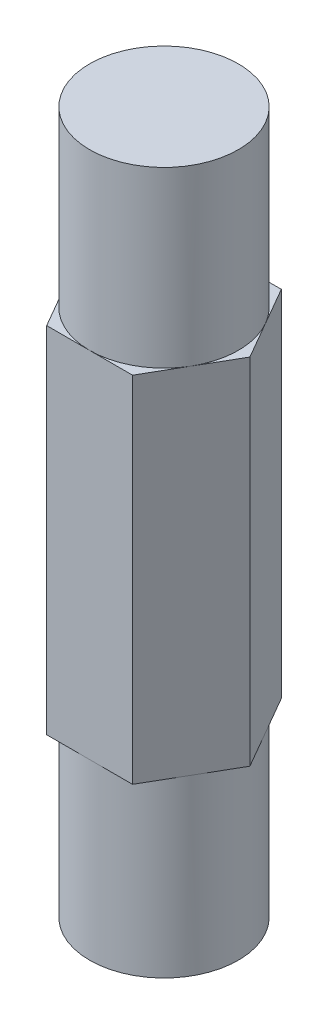
ISO-10303-21;
HEADER;
FILE_DESCRIPTION(('STEP AP214'),'2;1');
FILE_NAME('part.step','',(''),(''),'','','');
FILE_SCHEMA(('AUTOMOTIVE_DESIGN { 1 0 10303 214 1 1 1 1 }'));
ENDSEC;
DATA;
#1=APPLICATION_CONTEXT('core data for automotive mechanical design processes');
#2=APPLICATION_PROTOCOL_DEFINITION('international standard','automotive_design',2000,#1);
#3=PRODUCT_CONTEXT('',#1,'mechanical');
#4=PRODUCT('Part','Part','',(#3));
#5=PRODUCT_RELATED_PRODUCT_CATEGORY('part','',(#4));
#6=PRODUCT_DEFINITION_FORMATION('','',#4);
#7=PRODUCT_DEFINITION_CONTEXT('part definition',#1,'design');
#8=PRODUCT_DEFINITION('design','',#6,#7);
#9=PRODUCT_DEFINITION_SHAPE('','',#8);
#10=(LENGTH_UNIT() NAMED_UNIT(*) SI_UNIT(.MILLI.,.METRE.));
#11=(NAMED_UNIT(*) PLANE_ANGLE_UNIT() SI_UNIT($,.RADIAN.));
#12=(NAMED_UNIT(*) SI_UNIT($,.STERADIAN.) SOLID_ANGLE_UNIT());
#13=UNCERTAINTY_MEASURE_WITH_UNIT(LENGTH_MEASURE(1.E-05),#10,'distance_accuracy_value','');
#14=(GEOMETRIC_REPRESENTATION_CONTEXT(3) GLOBAL_UNCERTAINTY_ASSIGNED_CONTEXT((#13)) GLOBAL_UNIT_ASSIGNED_CONTEXT((#10,
#11,#12)) REPRESENTATION_CONTEXT('',''));
#15=CARTESIAN_POINT('',(0.,0.,0.));
#16=DIRECTION('',(0.,0.,1.));
#17=DIRECTION('',(1.,0.,0.));
#18=AXIS2_PLACEMENT_3D('',#15,#16,#17);
#19=CARTESIAN_POINT('',(-11.3221306570156,22.475,-32.0213126804892));
#20=DIRECTION('',(0.866025403784439,0.,0.5));
#21=DIRECTION('',(0.5,0.,-0.866025403784439));
#22=AXIS2_PLACEMENT_3D('',#19,#20,#21);
#23=PLANE('',#22);
#24=DIRECTION('',(-0.5,0.,0.866025403784439));
#25=VECTOR('',#24,1.);
#26=CARTESIAN_POINT('',(-22.3572331146759,-11.345,-12.9079545570934));
#27=LINE('',#26,#25);
#28=CARTESIAN_POINT('',(-12.6969459855234,-11.345,-29.6400626804892));
#29=VERTEX_POINT('',#28);
#30=CARTESIAN_POINT('',(-14.0717613140312,-11.345,-27.2588126804892));
#31=VERTEX_POINT('',#30);
#32=EDGE_CURVE('E179',#29,#31,#27,.T.);
#33=ORIENTED_EDGE('',*,*,#32,.T.);
#34=DIRECTION('',(0.,-1.,0.));
#35=VECTOR('',#34,1.);
#36=CARTESIAN_POINT('',(-14.0717613140312,22.475,-27.2588126804892));
#37=LINE('',#36,#35);
#38=CARTESIAN_POINT('',(-14.0717613140312,11.345,-27.2588126804892));
#39=VERTEX_POINT('',#38);
#40=EDGE_CURVE('E12',#39,#31,#37,.T.);
#41=ORIENTED_EDGE('',*,*,#40,.F.);
#42=DIRECTION('',(-0.5,0.,0.866025403784439));
#43=VECTOR('',#42,1.);
#44=CARTESIAN_POINT('',(-22.3572331146759,11.345,-12.9079545570934));
#45=LINE('',#44,#43);
#46=CARTESIAN_POINT('',(-12.6969459855234,11.345,-29.6400626804892));
#47=VERTEX_POINT('',#46);
#48=EDGE_CURVE('E224',#47,#39,#45,.T.);
#49=ORIENTED_EDGE('',*,*,#48,.F.);
#50=DIRECTION('',(-0.5,0.,0.866025403784439));
#51=VECTOR('',#50,1.);
#52=CARTESIAN_POINT('',(-22.3572331146759,11.345,-12.9079545570934));
#53=LINE('',#52,#51);
#54=CARTESIAN_POINT('',(-11.3221306570156,11.345,-32.0213126804892));
#55=VERTEX_POINT('',#54);
#56=EDGE_CURVE('E244',#55,#47,#53,.T.);
#57=ORIENTED_EDGE('',*,*,#56,.F.);
#58=DIRECTION('',(0.,-1.,0.));
#59=VECTOR('',#58,1.);
#60=CARTESIAN_POINT('',(-11.3221306570156,22.475,-32.0213126804892));
#61=LINE('',#60,#59);
#62=CARTESIAN_POINT('',(-11.3221306570156,-11.345,-32.0213126804892));
#63=VERTEX_POINT('',#62);
#64=EDGE_CURVE('E256',#55,#63,#61,.T.);
#65=ORIENTED_EDGE('',*,*,#64,.T.);
#66=DIRECTION('',(-0.5,0.,0.866025403784439));
#67=VECTOR('',#66,1.);
#68=CARTESIAN_POINT('',(-22.3572331146759,-11.345,-12.9079545570934));
#69=LINE('',#68,#67);
#70=EDGE_CURVE('E281',#63,#29,#69,.T.);
#71=ORIENTED_EDGE('',*,*,#70,.T.);
#72=EDGE_LOOP('',(#33,#41,#49,#57,#65,#71));
#73=FACE_BOUND('',#72,.T.);
#74=ADVANCED_FACE('F75',(#73),#23,.F.);
#75=CARTESIAN_POINT('',(-14.0717613140312,22.475,-27.2588126804892));
#76=DIRECTION('',(0.866025403784439,0.,-0.5));
#77=DIRECTION('',(-0.5,0.,-0.866025403784439));
#78=AXIS2_PLACEMENT_3D('',#75,#76,#77);
#79=PLANE('',#78);
#80=DIRECTION('',(0.5,0.,0.866025403784439));
#81=VECTOR('',#80,1.);
#82=CARTESIAN_POINT('',(1.24959114362914,-11.345,-0.721451783151254));
#83=LINE('',#82,#81);
#84=CARTESIAN_POINT('',(-12.6969459855234,-11.345,-24.8775626804892));
#85=VERTEX_POINT('',#84);
#86=EDGE_CURVE('E177',#31,#85,#83,.T.);
#87=ORIENTED_EDGE('',*,*,#86,.T.);
#88=DIRECTION('',(0.5,0.,0.866025403784439));
#89=VECTOR('',#88,1.);
#90=CARTESIAN_POINT('',(1.24959114362914,-11.345,-0.721451783151254));
#91=LINE('',#90,#89);
#92=CARTESIAN_POINT('',(-11.3221306570156,-11.345,-22.4963126804892));
#93=VERTEX_POINT('',#92);
#94=EDGE_CURVE('E190',#85,#93,#91,.T.);
#95=ORIENTED_EDGE('',*,*,#94,.T.);
#96=DIRECTION('',(0.,-1.,0.));
#97=VECTOR('',#96,1.);
#98=CARTESIAN_POINT('',(-11.3221306570156,22.475,-22.4963126804892));
#99=LINE('',#98,#97);
#100=CARTESIAN_POINT('',(-11.3221306570156,11.345,-22.4963126804892));
#101=VERTEX_POINT('',#100);
#102=EDGE_CURVE('E83',#101,#93,#99,.T.);
#103=ORIENTED_EDGE('',*,*,#102,.F.);
#104=DIRECTION('',(0.5,0.,0.866025403784439));
#105=VECTOR('',#104,1.);
#106=CARTESIAN_POINT('',(1.24959114362914,11.345,-0.721451783151254));
#107=LINE('',#106,#105);
#108=CARTESIAN_POINT('',(-12.6969459855234,11.345,-24.8775626804892));
#109=VERTEX_POINT('',#108);
#110=EDGE_CURVE('E90',#109,#101,#107,.T.);
#111=ORIENTED_EDGE('',*,*,#110,.F.);
#112=DIRECTION('',(0.5,0.,0.866025403784439));
#113=VECTOR('',#112,1.);
#114=CARTESIAN_POINT('',(1.24959114362914,11.345,-0.721451783151254));
#115=LINE('',#114,#113);
#116=EDGE_CURVE('E226',#39,#109,#115,.T.);
#117=ORIENTED_EDGE('',*,*,#116,.F.);
#118=ORIENTED_EDGE('',*,*,#40,.T.);
#119=EDGE_LOOP('',(#87,#95,#103,#111,#117,#118));
#120=FACE_BOUND('',#119,.T.);
#121=ADVANCED_FACE('F188',(#120),#79,.F.);
#122=CARTESIAN_POINT('',(-3.07323868596881,22.475,-27.2588126804892));
#123=DIRECTION('',(-0.866025403784439,0.,0.5));
#124=DIRECTION('',(0.5,0.,0.866025403784439));
#125=AXIS2_PLACEMENT_3D('',#122,#123,#124);
#126=PLANE('',#125);
#127=DIRECTION('',(-0.5,0.,-0.866025403784439));
#128=VECTOR('',#127,1.);
#129=CARTESIAN_POINT('',(9.49848311467592,-11.345,-5.48395178315126));
#130=LINE('',#129,#128);
#131=CARTESIAN_POINT('',(-4.4480540144766,-11.345,-29.6400626804892));
#132=VERTEX_POINT('',#131);
#133=CARTESIAN_POINT('',(-5.8228693429844,-11.345,-32.0213126804892));
#134=VERTEX_POINT('',#133);
#135=EDGE_CURVE('E289',#132,#134,#130,.T.);
#136=ORIENTED_EDGE('',*,*,#135,.T.);
#137=DIRECTION('',(0.,-1.,0.));
#138=VECTOR('',#137,1.);
#139=CARTESIAN_POINT('',(-5.8228693429844,22.475,-32.0213126804892));
#140=LINE('',#139,#138);
#141=CARTESIAN_POINT('',(-5.8228693429844,11.345,-32.0213126804892));
#142=VERTEX_POINT('',#141);
#143=EDGE_CURVE('E265',#142,#134,#140,.T.);
#144=ORIENTED_EDGE('',*,*,#143,.F.);
#145=DIRECTION('',(-0.5,0.,-0.866025403784439));
#146=VECTOR('',#145,1.);
#147=CARTESIAN_POINT('',(9.49848311467592,11.345,-5.48395178315126));
#148=LINE('',#147,#146);
#149=CARTESIAN_POINT('',(-4.4480540144766,11.345,-29.6400626804892));
#150=VERTEX_POINT('',#149);
#151=EDGE_CURVE('E231',#150,#142,#148,.T.);
#152=ORIENTED_EDGE('',*,*,#151,.F.);
#153=DIRECTION('',(-0.5,0.,-0.866025403784439));
#154=VECTOR('',#153,1.);
#155=CARTESIAN_POINT('',(9.49848311467592,11.345,-5.48395178315126));
#156=LINE('',#155,#154);
#157=CARTESIAN_POINT('',(-3.07323868596881,11.345,-27.2588126804892));
#158=VERTEX_POINT('',#157);
#159=EDGE_CURVE('E252',#158,#150,#156,.T.);
#160=ORIENTED_EDGE('',*,*,#159,.F.);
#161=DIRECTION('',(0.,-1.,0.));
#162=VECTOR('',#161,1.);
#163=CARTESIAN_POINT('',(-3.07323868596881,22.475,-27.2588126804892));
#164=LINE('',#163,#162);
#165=CARTESIAN_POINT('',(-3.07323868596881,-11.345,-27.2588126804892));
#166=VERTEX_POINT('',#165);
#167=EDGE_CURVE('E268',#158,#166,#164,.T.);
#168=ORIENTED_EDGE('',*,*,#167,.T.);
#169=DIRECTION('',(-0.5,0.,-0.866025403784439));
#170=VECTOR('',#169,1.);
#171=CARTESIAN_POINT('',(9.49848311467592,-11.345,-5.48395178315126));
#172=LINE('',#171,#170);
#173=EDGE_CURVE('E211',#166,#132,#172,.T.);
#174=ORIENTED_EDGE('',*,*,#173,.T.);
#175=EDGE_LOOP('',(#136,#144,#152,#160,#168,#174));
#176=FACE_BOUND('',#175,.T.);
#177=ADVANCED_FACE('F311',(#176),#126,.F.);
#178=CARTESIAN_POINT('',(-5.8228693429844,22.475,-32.0213126804892));
#179=DIRECTION('',(0.,0.,1.));
#180=DIRECTION('',(1.,0.,0.));
#181=AXIS2_PLACEMENT_3D('',#178,#179,#180);
#182=PLANE('',#181);
#183=DIRECTION('',(-1.,0.,0.));
#184=VECTOR('',#183,1.);
#185=CARTESIAN_POINT('',(0.,-11.345,-32.0213126804892));
#186=LINE('',#185,#184);
#187=CARTESIAN_POINT('',(-8.57249999999999,-11.345,-32.0213126804892));
#188=VERTEX_POINT('',#187);
#189=EDGE_CURVE('E284',#134,#188,#186,.T.);
#190=ORIENTED_EDGE('',*,*,#189,.T.);
#191=DIRECTION('',(-1.,0.,0.));
#192=VECTOR('',#191,1.);
#193=CARTESIAN_POINT('',(0.,-11.345,-32.0213126804892));
#194=LINE('',#193,#192);
#195=EDGE_CURVE('E220',#188,#63,#194,.T.);
#196=ORIENTED_EDGE('',*,*,#195,.T.);
#197=ORIENTED_EDGE('',*,*,#64,.F.);
#198=DIRECTION('',(-1.,0.,0.));
#199=VECTOR('',#198,1.);
#200=CARTESIAN_POINT('',(0.,11.345,-32.0213126804892));
#201=LINE('',#200,#199);
#202=CARTESIAN_POINT('',(-8.57249999999999,11.345,-32.0213126804892));
#203=VERTEX_POINT('',#202);
#204=EDGE_CURVE('E110',#203,#55,#201,.T.);
#205=ORIENTED_EDGE('',*,*,#204,.F.);
#206=DIRECTION('',(-1.,0.,0.));
#207=VECTOR('',#206,1.);
#208=CARTESIAN_POINT('',(0.,11.345,-32.0213126804892));
#209=LINE('',#208,#207);
#210=EDGE_CURVE('E118',#142,#203,#209,.T.);
#211=ORIENTED_EDGE('',*,*,#210,.F.);
#212=ORIENTED_EDGE('',*,*,#143,.T.);
#213=EDGE_LOOP('',(#190,#196,#197,#205,#211,#212));
#214=FACE_BOUND('',#213,.T.);
#215=ADVANCED_FACE('F304',(#214),#182,.F.);
#216=CARTESIAN_POINT('',(-11.3221306570156,22.475,-22.4963126804892));
#217=DIRECTION('',(0.,0.,-1.));
#218=DIRECTION('',(-1.,0.,0.));
#219=AXIS2_PLACEMENT_3D('',#216,#217,#218);
#220=PLANE('',#219);
#221=DIRECTION('',(1.,0.,0.));
#222=VECTOR('',#221,1.);
#223=CARTESIAN_POINT('',(0.,-11.345,-22.4963126804892));
#224=LINE('',#223,#222);
#225=CARTESIAN_POINT('',(-8.57249999999999,-11.345,-22.4963126804892));
#226=VERTEX_POINT('',#225);
#227=CARTESIAN_POINT('',(-5.8228693429844,-11.345,-22.4963126804892));
#228=VERTEX_POINT('',#227);
#229=EDGE_CURVE('E296',#226,#228,#224,.T.);
#230=ORIENTED_EDGE('',*,*,#229,.T.);
#231=DIRECTION('',(0.,-1.,0.));
#232=VECTOR('',#231,1.);
#233=CARTESIAN_POINT('',(-5.8228693429844,22.475,-22.4963126804892));
#234=LINE('',#233,#232);
#235=CARTESIAN_POINT('',(-5.8228693429844,11.345,-22.4963126804892));
#236=VERTEX_POINT('',#235);
#237=EDGE_CURVE('E271',#236,#228,#234,.T.);
#238=ORIENTED_EDGE('',*,*,#237,.F.);
#239=DIRECTION('',(1.,0.,0.));
#240=VECTOR('',#239,1.);
#241=CARTESIAN_POINT('',(0.,11.345,-22.4963126804892));
#242=LINE('',#241,#240);
#243=CARTESIAN_POINT('',(-8.57249999999999,11.345,-22.4963126804892));
#244=VERTEX_POINT('',#243);
#245=EDGE_CURVE('E236',#244,#236,#242,.T.);
#246=ORIENTED_EDGE('',*,*,#245,.F.);
#247=DIRECTION('',(1.,0.,0.));
#248=VECTOR('',#247,1.);
#249=CARTESIAN_POINT('',(0.,11.345,-22.4963126804892));
#250=LINE('',#249,#248);
#251=EDGE_CURVE('E254',#101,#244,#250,.T.);
#252=ORIENTED_EDGE('',*,*,#251,.F.);
#253=ORIENTED_EDGE('',*,*,#102,.T.);
#254=DIRECTION('',(1.,0.,0.));
#255=VECTOR('',#254,1.);
#256=CARTESIAN_POINT('',(0.,-11.345,-22.4963126804892));
#257=LINE('',#256,#255);
#258=EDGE_CURVE('E200',#93,#226,#257,.T.);
#259=ORIENTED_EDGE('',*,*,#258,.T.);
#260=EDGE_LOOP('',(#230,#238,#246,#252,#253,#259));
#261=FACE_BOUND('',#260,.T.);
#262=ADVANCED_FACE('F275',(#261),#220,.F.);
#263=CARTESIAN_POINT('',(-5.8228693429844,22.475,-22.4963126804892));
#264=DIRECTION('',(-0.866025403784439,0.,-0.5));
#265=DIRECTION('',(-0.5,0.,0.866025403784439));
#266=AXIS2_PLACEMENT_3D('',#263,#264,#265);
#267=PLANE('',#266);
#268=DIRECTION('',(0.5,0.,-0.866025403784439));
#269=VECTOR('',#268,1.);
#270=CARTESIAN_POINT('',(-14.1083411436291,-11.345,-8.14545455709335));
#271=LINE('',#270,#269);
#272=CARTESIAN_POINT('',(-4.44805401447661,-11.345,-24.8775626804892));
#273=VERTEX_POINT('',#272);
#274=EDGE_CURVE('E293',#228,#273,#271,.T.);
#275=ORIENTED_EDGE('',*,*,#274,.T.);
#276=DIRECTION('',(0.5,0.,-0.866025403784439));
#277=VECTOR('',#276,1.);
#278=CARTESIAN_POINT('',(-14.1083411436291,-11.345,-8.14545455709335));
#279=LINE('',#278,#277);
#280=EDGE_CURVE('E207',#273,#166,#279,.T.);
#281=ORIENTED_EDGE('',*,*,#280,.T.);
#282=ORIENTED_EDGE('',*,*,#167,.F.);
#283=DIRECTION('',(0.5,0.,-0.866025403784439));
#284=VECTOR('',#283,1.);
#285=CARTESIAN_POINT('',(-14.1083411436291,11.345,-8.14545455709335));
#286=LINE('',#285,#284);
#287=CARTESIAN_POINT('',(-4.44805401447661,11.345,-24.8775626804892));
#288=VERTEX_POINT('',#287);
#289=EDGE_CURVE('E259',#288,#158,#286,.T.);
#290=ORIENTED_EDGE('',*,*,#289,.F.);
#291=DIRECTION('',(0.5,0.,-0.866025403784439));
#292=VECTOR('',#291,1.);
#293=CARTESIAN_POINT('',(-14.1083411436291,11.345,-8.14545455709335));
#294=LINE('',#293,#292);
#295=EDGE_CURVE('E102',#236,#288,#294,.T.);
#296=ORIENTED_EDGE('',*,*,#295,.F.);
#297=ORIENTED_EDGE('',*,*,#237,.T.);
#298=EDGE_LOOP('',(#275,#281,#282,#290,#296,#297));
#299=FACE_BOUND('',#298,.T.);
#300=ADVANCED_FACE('F321',(#299),#267,.F.);
#301=CARTESIAN_POINT('',(0.,22.475,0.));
#302=DIRECTION('',(0.,1.,0.));
#303=DIRECTION('',(0.,0.,1.));
#304=AXIS2_PLACEMENT_3D('',#301,#302,#303);
#305=PLANE('',#304);
#306=CARTESIAN_POINT('',(-8.57249999999999,22.475,-27.2588126804892));
#307=DIRECTION('',(0.,1.,0.));
#308=DIRECTION('',(0.,0.,1.));
#309=AXIS2_PLACEMENT_3D('',#306,#307,#308);
#310=CIRCLE('',#309,4.7625);
#311=CARTESIAN_POINT('',(-8.57249999999999,22.475,-22.4963126804892));
#312=VERTEX_POINT('',#311);
#313=EDGE_CURVE('E239',#312,#312,#310,.T.);
#314=ORIENTED_EDGE('',*,*,#313,.T.);
#315=EDGE_LOOP('',(#314));
#316=FACE_BOUND('',#315,.T.);
#317=ADVANCED_FACE('F351',(#316),#305,.T.);
#318=CARTESIAN_POINT('',(0.,-22.475,0.));
#319=DIRECTION('',(0.,1.,0.));
#320=DIRECTION('',(0.,0.,1.));
#321=AXIS2_PLACEMENT_3D('',#318,#319,#320);
#322=PLANE('',#321);
#323=CARTESIAN_POINT('',(-8.57249999999999,-22.475,-27.2588126804892));
#324=DIRECTION('',(0.,1.,0.));
#325=DIRECTION('',(0.,0.,1.));
#326=AXIS2_PLACEMENT_3D('',#323,#324,#325);
#327=CIRCLE('',#326,4.7625);
#328=CARTESIAN_POINT('',(-8.57249999999999,-22.475,-22.4963126804892));
#329=VERTEX_POINT('',#328);
#330=EDGE_CURVE('E214',#329,#329,#327,.T.);
#331=ORIENTED_EDGE('',*,*,#330,.F.);
#332=EDGE_LOOP('',(#331));
#333=FACE_BOUND('',#332,.T.);
#334=ADVANCED_FACE('F355',(#333),#322,.F.);
#335=CARTESIAN_POINT('',(0.,11.345,0.));
#336=DIRECTION('',(0.,1.,0.));
#337=DIRECTION('',(0.,0.,1.));
#338=AXIS2_PLACEMENT_3D('',#335,#336,#337);
#339=PLANE('',#338);
#340=CARTESIAN_POINT('',(-8.57249999999999,11.345,-27.2588126804892));
#341=DIRECTION('',(0.,1.,0.));
#342=DIRECTION('',(0.,0.,1.));
#343=AXIS2_PLACEMENT_3D('',#340,#341,#342);
#344=CIRCLE('',#343,4.7625);
#345=EDGE_CURVE('E249',#109,#244,#344,.T.);
#346=ORIENTED_EDGE('',*,*,#345,.F.);
#347=ORIENTED_EDGE('',*,*,#110,.T.);
#348=ORIENTED_EDGE('',*,*,#251,.T.);
#349=EDGE_LOOP('',(#346,#347,#348));
#350=FACE_BOUND('',#349,.T.);
#351=ADVANCED_FACE('F358',(#350),#339,.T.);
#352=CARTESIAN_POINT('',(0.,11.345,0.));
#353=DIRECTION('',(0.,1.,0.));
#354=DIRECTION('',(0.,0.,1.));
#355=AXIS2_PLACEMENT_3D('',#352,#353,#354);
#356=PLANE('',#355);
#357=CARTESIAN_POINT('',(-8.57249999999999,11.345,-27.2588126804892));
#358=DIRECTION('',(0.,1.,0.));
#359=DIRECTION('',(0.,0.,1.));
#360=AXIS2_PLACEMENT_3D('',#357,#358,#359);
#361=CIRCLE('',#360,4.7625);
#362=EDGE_CURVE('E246',#288,#150,#361,.T.);
#363=ORIENTED_EDGE('',*,*,#362,.F.);
#364=ORIENTED_EDGE('',*,*,#289,.T.);
#365=ORIENTED_EDGE('',*,*,#159,.T.);
#366=EDGE_LOOP('',(#363,#364,#365));
#367=FACE_BOUND('',#366,.T.);
#368=ADVANCED_FACE('F325',(#367),#356,.T.);
#369=CARTESIAN_POINT('',(-8.57249999999999,11.345,-27.2588126804892));
#370=DIRECTION('',(0.,1.,0.));
#371=DIRECTION('',(0.,0.,1.));
#372=AXIS2_PLACEMENT_3D('',#369,#370,#371);
#373=CYLINDRICAL_SURFACE('',#372,4.7625);
#374=ORIENTED_EDGE('',*,*,#313,.F.);
#375=EDGE_LOOP('',(#374));
#376=FACE_BOUND('',#375,.T.);
#377=CARTESIAN_POINT('',(-8.57249999999999,11.345,-27.2588126804892));
#378=DIRECTION('',(0.,1.,0.));
#379=DIRECTION('',(0.,0.,1.));
#380=AXIS2_PLACEMENT_3D('',#377,#378,#379);
#381=CIRCLE('',#380,4.7625);
#382=EDGE_CURVE('E201',#47,#109,#381,.T.);
#383=ORIENTED_EDGE('',*,*,#382,.T.);
#384=ORIENTED_EDGE('',*,*,#345,.T.);
#385=CARTESIAN_POINT('',(-8.57249999999999,11.345,-27.2588126804892));
#386=DIRECTION('',(0.,1.,0.));
#387=DIRECTION('',(0.,0.,1.));
#388=AXIS2_PLACEMENT_3D('',#385,#386,#387);
#389=CIRCLE('',#388,4.7625);
#390=EDGE_CURVE('E234',#244,#288,#389,.T.);
#391=ORIENTED_EDGE('',*,*,#390,.T.);
#392=ORIENTED_EDGE('',*,*,#362,.T.);
#393=CARTESIAN_POINT('',(-8.57249999999999,11.345,-27.2588126804892));
#394=DIRECTION('',(0.,1.,0.));
#395=DIRECTION('',(0.,0.,1.));
#396=AXIS2_PLACEMENT_3D('',#393,#394,#395);
#397=CIRCLE('',#396,4.7625);
#398=EDGE_CURVE('E229',#150,#203,#397,.T.);
#399=ORIENTED_EDGE('',*,*,#398,.T.);
#400=CARTESIAN_POINT('',(-8.57249999999999,11.345,-27.2588126804892));
#401=DIRECTION('',(0.,1.,0.));
#402=DIRECTION('',(0.,0.,1.));
#403=AXIS2_PLACEMENT_3D('',#400,#401,#402);
#404=CIRCLE('',#403,4.7625);
#405=EDGE_CURVE('E240',#203,#47,#404,.T.);
#406=ORIENTED_EDGE('',*,*,#405,.T.);
#407=EDGE_LOOP('',(#383,#384,#391,#392,#399,#406));
#408=FACE_BOUND('',#407,.T.);
#409=ADVANCED_FACE('F365',(#376,#408),#373,.T.);
#410=CARTESIAN_POINT('',(0.,11.345,0.));
#411=DIRECTION('',(0.,1.,0.));
#412=DIRECTION('',(0.,0.,1.));
#413=AXIS2_PLACEMENT_3D('',#410,#411,#412);
#414=PLANE('',#413);
#415=ORIENTED_EDGE('',*,*,#405,.F.);
#416=ORIENTED_EDGE('',*,*,#204,.T.);
#417=ORIENTED_EDGE('',*,*,#56,.T.);
#418=EDGE_LOOP('',(#415,#416,#417));
#419=FACE_BOUND('',#418,.T.);
#420=ADVANCED_FACE('F306',(#419),#414,.T.);
#421=CARTESIAN_POINT('',(0.,11.345,0.));
#422=DIRECTION('',(0.,1.,0.));
#423=DIRECTION('',(0.,0.,1.));
#424=AXIS2_PLACEMENT_3D('',#421,#422,#423);
#425=PLANE('',#424);
#426=ORIENTED_EDGE('',*,*,#390,.F.);
#427=ORIENTED_EDGE('',*,*,#245,.T.);
#428=ORIENTED_EDGE('',*,*,#295,.T.);
#429=EDGE_LOOP('',(#426,#427,#428));
#430=FACE_BOUND('',#429,.T.);
#431=ADVANCED_FACE('F373',(#430),#425,.T.);
#432=CARTESIAN_POINT('',(0.,11.345,0.));
#433=DIRECTION('',(0.,1.,0.));
#434=DIRECTION('',(0.,0.,1.));
#435=AXIS2_PLACEMENT_3D('',#432,#433,#434);
#436=PLANE('',#435);
#437=ORIENTED_EDGE('',*,*,#398,.F.);
#438=ORIENTED_EDGE('',*,*,#151,.T.);
#439=ORIENTED_EDGE('',*,*,#210,.T.);
#440=EDGE_LOOP('',(#437,#438,#439));
#441=FACE_BOUND('',#440,.T.);
#442=ADVANCED_FACE('F376',(#441),#436,.T.);
#443=CARTESIAN_POINT('',(0.,11.345,0.));
#444=DIRECTION('',(0.,1.,0.));
#445=DIRECTION('',(0.,0.,1.));
#446=AXIS2_PLACEMENT_3D('',#443,#444,#445);
#447=PLANE('',#446);
#448=ORIENTED_EDGE('',*,*,#382,.F.);
#449=ORIENTED_EDGE('',*,*,#48,.T.);
#450=ORIENTED_EDGE('',*,*,#116,.T.);
#451=EDGE_LOOP('',(#448,#449,#450));
#452=FACE_BOUND('',#451,.T.);
#453=ADVANCED_FACE('F379',(#452),#447,.T.);
#454=CARTESIAN_POINT('',(0.,-11.345,0.));
#455=DIRECTION('',(0.,-1.,0.));
#456=DIRECTION('',(0.,0.,1.));
#457=AXIS2_PLACEMENT_3D('',#454,#455,#456);
#458=PLANE('',#457);
#459=CARTESIAN_POINT('',(-8.57249999999999,-11.345,-27.2588126804892));
#460=DIRECTION('',(0.,1.,0.));
#461=DIRECTION('',(0.,0.,1.));
#462=AXIS2_PLACEMENT_3D('',#459,#460,#461);
#463=CIRCLE('',#462,4.7625);
#464=EDGE_CURVE('E198',#85,#226,#463,.T.);
#465=ORIENTED_EDGE('',*,*,#464,.T.);
#466=ORIENTED_EDGE('',*,*,#258,.F.);
#467=ORIENTED_EDGE('',*,*,#94,.F.);
#468=EDGE_LOOP('',(#465,#466,#467));
#469=FACE_BOUND('',#468,.T.);
#470=ADVANCED_FACE('F197',(#469),#458,.T.);
#471=CARTESIAN_POINT('',(0.,-11.345,0.));
#472=DIRECTION('',(0.,-1.,0.));
#473=DIRECTION('',(0.,0.,1.));
#474=AXIS2_PLACEMENT_3D('',#471,#472,#473);
#475=PLANE('',#474);
#476=CARTESIAN_POINT('',(-8.57249999999999,-11.345,-27.2588126804892));
#477=DIRECTION('',(0.,1.,0.));
#478=DIRECTION('',(0.,0.,1.));
#479=AXIS2_PLACEMENT_3D('',#476,#477,#478);
#480=CIRCLE('',#479,4.7625);
#481=EDGE_CURVE('E217',#273,#132,#480,.T.);
#482=ORIENTED_EDGE('',*,*,#481,.T.);
#483=ORIENTED_EDGE('',*,*,#173,.F.);
#484=ORIENTED_EDGE('',*,*,#280,.F.);
#485=EDGE_LOOP('',(#482,#483,#484));
#486=FACE_BOUND('',#485,.T.);
#487=ADVANCED_FACE('F318',(#486),#475,.T.);
#488=CARTESIAN_POINT('',(-8.57249999999999,-11.345,-27.2588126804892));
#489=DIRECTION('',(0.,-1.,0.));
#490=DIRECTION('',(0.,0.,-1.));
#491=AXIS2_PLACEMENT_3D('',#488,#489,#490);
#492=CYLINDRICAL_SURFACE('',#491,4.7625);
#493=ORIENTED_EDGE('',*,*,#330,.T.);
#494=EDGE_LOOP('',(#493));
#495=FACE_BOUND('',#494,.T.);
#496=CARTESIAN_POINT('',(-8.57249999999999,-11.345,-27.2588126804892));
#497=DIRECTION('',(0.,1.,0.));
#498=DIRECTION('',(0.,0.,1.));
#499=AXIS2_PLACEMENT_3D('',#496,#497,#498);
#500=CIRCLE('',#499,4.7625);
#501=EDGE_CURVE('E174',#29,#85,#500,.T.);
#502=ORIENTED_EDGE('',*,*,#501,.F.);
#503=CARTESIAN_POINT('',(-8.57249999999999,-11.345,-27.2588126804892));
#504=DIRECTION('',(0.,1.,0.));
#505=DIRECTION('',(0.,0.,1.));
#506=AXIS2_PLACEMENT_3D('',#503,#504,#505);
#507=CIRCLE('',#506,4.7625);
#508=EDGE_CURVE('E298',#188,#29,#507,.T.);
#509=ORIENTED_EDGE('',*,*,#508,.F.);
#510=CARTESIAN_POINT('',(-8.57249999999999,-11.345,-27.2588126804892));
#511=DIRECTION('',(0.,1.,0.));
#512=DIRECTION('',(0.,0.,1.));
#513=AXIS2_PLACEMENT_3D('',#510,#511,#512);
#514=CIRCLE('',#513,4.7625);
#515=EDGE_CURVE('E282',#132,#188,#514,.T.);
#516=ORIENTED_EDGE('',*,*,#515,.F.);
#517=ORIENTED_EDGE('',*,*,#481,.F.);
#518=CARTESIAN_POINT('',(-8.57249999999999,-11.345,-27.2588126804892));
#519=DIRECTION('',(0.,1.,0.));
#520=DIRECTION('',(0.,0.,1.));
#521=AXIS2_PLACEMENT_3D('',#518,#519,#520);
#522=CIRCLE('',#521,4.7625);
#523=EDGE_CURVE('E206',#226,#273,#522,.T.);
#524=ORIENTED_EDGE('',*,*,#523,.F.);
#525=ORIENTED_EDGE('',*,*,#464,.F.);
#526=EDGE_LOOP('',(#502,#509,#516,#517,#524,#525));
#527=FACE_BOUND('',#526,.T.);
#528=ADVANCED_FACE('F204',(#495,#527),#492,.T.);
#529=CARTESIAN_POINT('',(0.,-11.345,0.));
#530=DIRECTION('',(0.,-1.,0.));
#531=DIRECTION('',(0.,0.,1.));
#532=AXIS2_PLACEMENT_3D('',#529,#530,#531);
#533=PLANE('',#532);
#534=ORIENTED_EDGE('',*,*,#508,.T.);
#535=ORIENTED_EDGE('',*,*,#70,.F.);
#536=ORIENTED_EDGE('',*,*,#195,.F.);
#537=EDGE_LOOP('',(#534,#535,#536));
#538=FACE_BOUND('',#537,.T.);
#539=ADVANCED_FACE('F330',(#538),#533,.T.);
#540=CARTESIAN_POINT('',(0.,-11.345,0.));
#541=DIRECTION('',(0.,-1.,0.));
#542=DIRECTION('',(0.,0.,1.));
#543=AXIS2_PLACEMENT_3D('',#540,#541,#542);
#544=PLANE('',#543);
#545=ORIENTED_EDGE('',*,*,#523,.T.);
#546=ORIENTED_EDGE('',*,*,#274,.F.);
#547=ORIENTED_EDGE('',*,*,#229,.F.);
#548=EDGE_LOOP('',(#545,#546,#547));
#549=FACE_BOUND('',#548,.T.);
#550=ADVANCED_FACE('F328',(#549),#544,.T.);
#551=CARTESIAN_POINT('',(0.,-11.345,0.));
#552=DIRECTION('',(0.,-1.,0.));
#553=DIRECTION('',(0.,0.,1.));
#554=AXIS2_PLACEMENT_3D('',#551,#552,#553);
#555=PLANE('',#554);
#556=ORIENTED_EDGE('',*,*,#515,.T.);
#557=ORIENTED_EDGE('',*,*,#189,.F.);
#558=ORIENTED_EDGE('',*,*,#135,.F.);
#559=EDGE_LOOP('',(#556,#557,#558));
#560=FACE_BOUND('',#559,.T.);
#561=ADVANCED_FACE('F315',(#560),#555,.T.);
#562=CARTESIAN_POINT('',(0.,-11.345,0.));
#563=DIRECTION('',(0.,-1.,0.));
#564=DIRECTION('',(0.,0.,1.));
#565=AXIS2_PLACEMENT_3D('',#562,#563,#564);
#566=PLANE('',#565);
#567=ORIENTED_EDGE('',*,*,#501,.T.);
#568=ORIENTED_EDGE('',*,*,#86,.F.);
#569=ORIENTED_EDGE('',*,*,#32,.F.);
#570=EDGE_LOOP('',(#567,#568,#569));
#571=FACE_BOUND('',#570,.T.);
#572=ADVANCED_FACE('F176',(#571),#566,.T.);
#573=CLOSED_SHELL('',(#74,#121,#177,#215,#262,#300,#317,#334,#351,#368,#409,#420,#431,#442,#453,
#470,#487,#528,#539,#550,#561,#572));
#574=MANIFOLD_SOLID_BREP('B2',#573);
#575=ADVANCED_BREP_SHAPE_REPRESENTATION('',(#18,#574),#14);
#576=SHAPE_DEFINITION_REPRESENTATION(#9,#575);
ENDSEC;
END-ISO-10303-21;
